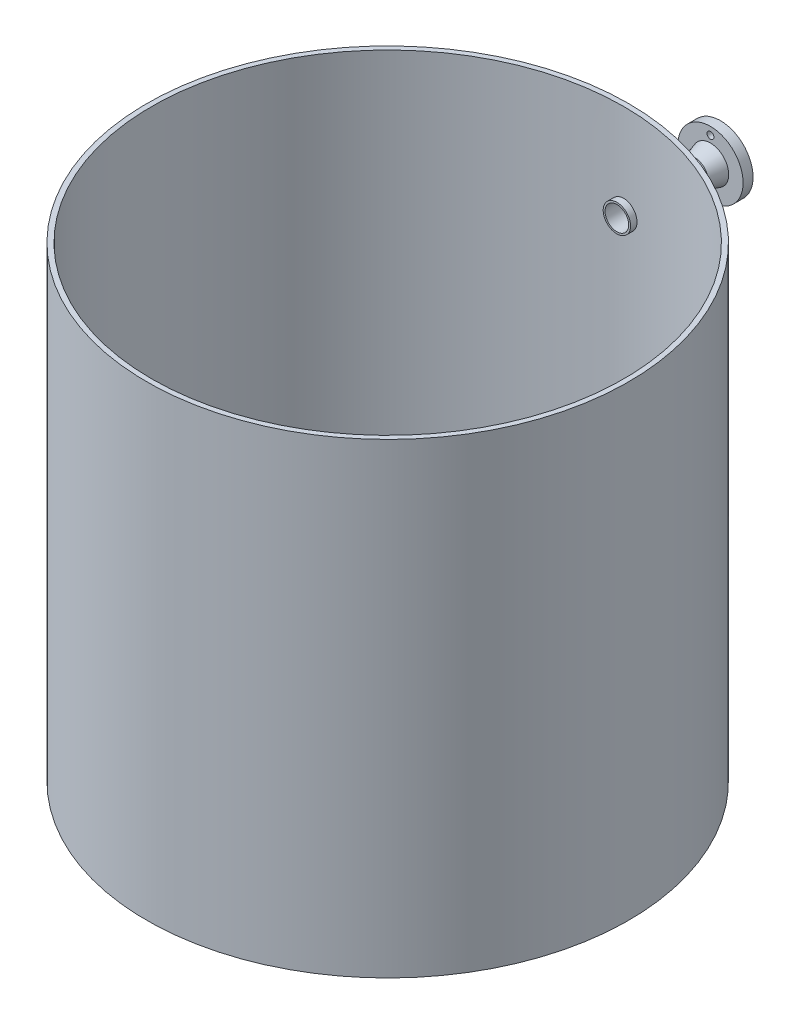
ISO-10303-21;
HEADER;
FILE_DESCRIPTION(('STEP AP214'),'2;1');
FILE_NAME('part.step','',(''),(''),'','','');
FILE_SCHEMA(('AUTOMOTIVE_DESIGN { 1 0 10303 214 1 1 1 1 }'));
ENDSEC;
DATA;
#1=APPLICATION_CONTEXT('core data for automotive mechanical design processes');
#2=APPLICATION_PROTOCOL_DEFINITION('international standard','automotive_design',2000,#1);
#3=PRODUCT_CONTEXT('',#1,'mechanical');
#4=PRODUCT('Part','Part','',(#3));
#5=PRODUCT_RELATED_PRODUCT_CATEGORY('part','',(#4));
#6=PRODUCT_DEFINITION_FORMATION('','',#4);
#7=PRODUCT_DEFINITION_CONTEXT('part definition',#1,'design');
#8=PRODUCT_DEFINITION('design','',#6,#7);
#9=PRODUCT_DEFINITION_SHAPE('','',#8);
#10=(LENGTH_UNIT() NAMED_UNIT(*) SI_UNIT(.MILLI.,.METRE.));
#11=(NAMED_UNIT(*) PLANE_ANGLE_UNIT() SI_UNIT($,.RADIAN.));
#12=(NAMED_UNIT(*) SI_UNIT($,.STERADIAN.) SOLID_ANGLE_UNIT());
#13=UNCERTAINTY_MEASURE_WITH_UNIT(LENGTH_MEASURE(1.E-05),#10,'distance_accuracy_value','');
#14=(GEOMETRIC_REPRESENTATION_CONTEXT(3) GLOBAL_UNCERTAINTY_ASSIGNED_CONTEXT((#13)) GLOBAL_UNIT_ASSIGNED_CONTEXT((#10,
#11,#12)) REPRESENTATION_CONTEXT('',''));
#15=CARTESIAN_POINT('',(0.,0.,0.));
#16=DIRECTION('',(0.,0.,1.));
#17=DIRECTION('',(1.,0.,0.));
#18=AXIS2_PLACEMENT_3D('',#15,#16,#17);
#19=CARTESIAN_POINT('',(0.,0.,0.));
#20=DIRECTION('',(0.,-1.,0.));
#21=DIRECTION('',(0.,0.,-1.));
#22=AXIS2_PLACEMENT_3D('',#19,#20,#21);
#23=CYLINDRICAL_SURFACE('',#22,775.);
#24=CARTESIAN_POINT('',(0.,0.,0.));
#25=DIRECTION('',(0.,-1.,0.));
#26=DIRECTION('',(0.,0.,-1.));
#27=AXIS2_PLACEMENT_3D('',#24,#25,#26);
#28=CIRCLE('',#27,775.);
#29=CARTESIAN_POINT('',(0.,0.,-775.));
#30=VERTEX_POINT('',#29);
#31=EDGE_CURVE('E10',#30,#30,#28,.T.);
#32=ORIENTED_EDGE('',*,*,#31,.F.);
#33=EDGE_LOOP('',(#32));
#34=FACE_BOUND('',#33,.T.);
#35=CARTESIAN_POINT('',(0.,1500.,0.));
#36=DIRECTION('',(0.,-1.,0.));
#37=DIRECTION('',(0.,0.,-1.));
#38=AXIS2_PLACEMENT_3D('',#35,#36,#37);
#39=CIRCLE('',#38,775.);
#40=CARTESIAN_POINT('',(0.,1500.,-775.));
#41=VERTEX_POINT('',#40);
#42=EDGE_CURVE('E55',#41,#41,#39,.T.);
#43=ORIENTED_EDGE('',*,*,#42,.T.);
#44=EDGE_LOOP('',(#43));
#45=FACE_BOUND('',#44,.T.);
#46=CARTESIAN_POINT('',(0.,1244.,-775.));
#47=CARTESIAN_POINT('',(-1.23490051270524,1243.99999187195,-774.999998842845));
#48=CARTESIAN_POINT('',(-2.47003103419844,1243.94796753575,-774.997040489617));
#49=CARTESIAN_POINT('',(-4.93170333839809,1243.74019773534,-774.985286612463));
#50=CARTESIAN_POINT('',(-6.15824284475578,1243.58442575921,-774.976489596512));
#51=CARTESIAN_POINT('',(-8.59516346996752,1243.17003812287,-774.953294943767));
#52=CARTESIAN_POINT('',(-9.80552576295013,1242.91131187748,-774.938891285133));
#53=CARTESIAN_POINT('',(-12.2000078789076,1242.29289276721,-774.904893258689));
#54=CARTESIAN_POINT('',(-13.3841293849541,1241.9332063982,-774.885299224838));
#55=CARTESIAN_POINT('',(-15.7172270865087,1241.11564098644,-774.841486712522));
#56=CARTESIAN_POINT('',(-16.8662204291204,1240.65781075416,-774.817270533468));
#57=CARTESIAN_POINT('',(-19.1215445472124,1239.64711295547,-774.764892751855));
#58=CARTESIAN_POINT('',(-20.2278746716534,1239.09424393947,-774.736731089118));
#59=CARTESIAN_POINT('',(-22.3897625474472,1237.8975543117,-774.677266846262));
#60=CARTESIAN_POINT('',(-23.4453324276264,1237.2537555732,-774.645965022038));
#61=CARTESIAN_POINT('',(-25.4985199809759,1235.87967940291,-774.581100101539));
#62=CARTESIAN_POINT('',(-26.4961378223297,1235.14940222211,-774.547537011828));
#63=CARTESIAN_POINT('',(-28.4274514765434,1233.60668362056,-774.479060351873));
#64=CARTESIAN_POINT('',(-29.3610750770105,1232.794151861,-774.444145323375));
#65=CARTESIAN_POINT('',(-31.1565758459052,1231.09335808243,-774.373989231741));
#66=CARTESIAN_POINT('',(-32.0184528979582,1230.20509594057,-774.338748168076));
#67=CARTESIAN_POINT('',(-33.6643889461261,1228.35909352097,-774.268937557171));
#68=CARTESIAN_POINT('',(-34.4484447577514,1227.40135040279,-774.234368037458));
#69=CARTESIAN_POINT('',(-35.9331375052938,1225.42319766106,-774.166882568525));
#70=CARTESIAN_POINT('',(-36.6337744419652,1224.40278803806,-774.133966619289));
#71=CARTESIAN_POINT('',(-37.9470868631644,1222.3058313769,-774.07070173934));
#72=CARTESIAN_POINT('',(-38.5597037238939,1221.22924756978,-774.040354524952));
#73=CARTESIAN_POINT('',(-39.6920543141824,1219.02820346665,-773.983115052941));
#74=CARTESIAN_POINT('',(-40.2117879867743,1217.90374314127,-773.956222797436));
#75=CARTESIAN_POINT('',(-41.1546521384797,1215.61494450225,-773.906659508791));
#76=CARTESIAN_POINT('',(-41.5777833460667,1214.4506064894,-773.88398844382));
#77=CARTESIAN_POINT('',(-42.3244137800963,1212.09033014446,-773.843513837326));
#78=CARTESIAN_POINT('',(-42.6479131207903,1210.8943918486,-773.825710290221));
#79=CARTESIAN_POINT('',(-43.1926589637929,1208.48075166062,-773.795495361883));
#80=CARTESIAN_POINT('',(-43.4140163750361,1207.26307487277,-773.783078132898));
#81=CARTESIAN_POINT('',(-43.7534069106335,1204.81336159404,-773.763961642556));
#82=CARTESIAN_POINT('',(-43.871440102168,1203.5813251125,-773.757262377482));
#83=CARTESIAN_POINT('',(-44.0033326626017,1201.11168155063,-773.749772925279));
#84=CARTESIAN_POINT('',(-44.0171929420212,1199.87407451909,-773.748982686503));
#85=CARTESIAN_POINT('',(-43.9406422798857,1197.40210039917,-773.753333700491));
#86=CARTESIAN_POINT('',(-43.8502314024187,1196.16773330881,-773.758474949609));
#87=CARTESIAN_POINT('',(-43.5659544004203,1193.71246127161,-773.774532924487));
#88=CARTESIAN_POINT('',(-43.3722084060785,1192.49154236962,-773.785442943751));
#89=CARTESIAN_POINT('',(-42.8827259116379,1190.07038704197,-773.812723992964));
#90=CARTESIAN_POINT('',(-42.5869895028973,1188.87015059778,-773.82909501802));
#91=CARTESIAN_POINT('',(-41.8956415874253,1186.49887207576,-773.866832819246));
#92=CARTESIAN_POINT('',(-41.500029693993,1185.32783011099,-773.888199614758));
#93=CARTESIAN_POINT('',(-40.6117563621746,1183.02324272447,-773.93532217017));
#94=CARTESIAN_POINT('',(-40.1190948389351,1181.88969733551,-773.961077933908));
#95=CARTESIAN_POINT('',(-39.0399172855946,1179.66747758639,-774.016263889724));
#96=CARTESIAN_POINT('',(-38.45334680132,1178.57882972402,-774.045696211506));
#97=CARTESIAN_POINT('',(-37.1907285913545,1176.45480664729,-774.107388550468));
#98=CARTESIAN_POINT('',(-36.5146808429977,1175.41943144644,-774.139648568364));
#99=CARTESIAN_POINT('',(-35.0778991677216,1173.40926324083,-774.206082362964));
#100=CARTESIAN_POINT('',(-34.317164585353,1172.43447070505,-774.240256154478));
#101=CARTESIAN_POINT('',(-32.716399919732,1170.55236213383,-774.309549705754));
#102=CARTESIAN_POINT('',(-31.8763697576633,1169.64504616546,-774.344669466455));
#103=CARTESIAN_POINT('',(-30.1217110477526,1167.90306851879,-774.414910964716));
#104=CARTESIAN_POINT('',(-29.2069785635247,1167.06851152712,-774.450032634671));
#105=CARTESIAN_POINT('',(-27.3104300472603,1165.47941271593,-774.519231916416));
#106=CARTESIAN_POINT('',(-26.3286139476378,1164.72487097702,-774.553309527155));
#107=CARTESIAN_POINT('',(-24.3048532152042,1163.30116148562,-774.619454242604));
#108=CARTESIAN_POINT('',(-23.262908527529,1162.63199381104,-774.651521345481));
#109=CARTESIAN_POINT('',(-21.1262774440984,1161.38379619256,-774.712735428498));
#110=CARTESIAN_POINT('',(-20.0315910712869,1160.80476620946,-774.741882409909));
#111=CARTESIAN_POINT('',(-17.7971965419089,1159.74095242246,-774.796430387714));
#112=CARTESIAN_POINT('',(-16.6574864967475,1159.25617257711,-774.821831226757));
#113=CARTESIAN_POINT('',(-14.3411861186688,1158.38435743867,-774.868164319476));
#114=CARTESIAN_POINT('',(-13.1645957787506,1157.99732216413,-774.889096572304));
#115=CARTESIAN_POINT('',(-10.7829176708565,1157.32377491677,-774.925897741629));
#116=CARTESIAN_POINT('',(-9.57783012789139,1157.03726215052,-774.941766698092));
#117=CARTESIAN_POINT('',(-7.14773724539119,1156.56681551491,-774.967990480062));
#118=CARTESIAN_POINT('',(-5.92273192959694,1156.3828815233,-774.978345312139));
#119=CARTESIAN_POINT('',(-3.46325858723033,1156.11910029925,-774.993236099942));
#120=CARTESIAN_POINT('',(-2.22880612600184,1156.03910837676,-774.997780144293));
#121=CARTESIAN_POINT('',(0.24245817873926,1155.98331253725,-775.000947088034));
#122=CARTESIAN_POINT('',(1.47927002007144,1156.007508524,-774.999569992892));
#123=CARTESIAN_POINT('',(3.94644224397655,1156.15991411186,-774.990933734942));
#124=CARTESIAN_POINT('',(5.17680265316937,1156.28812328346,-774.983674596422));
#125=CARTESIAN_POINT('',(7.62232075836766,1156.64763354004,-774.963480128506));
#126=CARTESIAN_POINT('',(8.8374784556896,1156.8789346161,-774.950544799601));
#127=CARTESIAN_POINT('',(11.2431615978747,1157.44278403041,-774.919374869633));
#128=CARTESIAN_POINT('',(12.433702649046,1157.77526598104,-774.901143743646));
#129=CARTESIAN_POINT('',(14.7825277813347,1158.53915102427,-774.859894868812));
#130=CARTESIAN_POINT('',(15.940811881656,1158.97055405796,-774.836877122816));
#131=CARTESIAN_POINT('',(18.2169269912185,1159.92920626858,-774.786705840629));
#132=CARTESIAN_POINT('',(19.334757767408,1160.45645599757,-774.759552280618));
#133=CARTESIAN_POINT('',(21.5220548577472,1161.60304835278,-774.701877010902));
#134=CARTESIAN_POINT('',(22.5915211167051,1162.22239108409,-774.671355297354));
#135=CARTESIAN_POINT('',(24.6756837113987,1163.54950541334,-774.607771054481));
#136=CARTESIAN_POINT('',(25.6903183552265,1164.25737376367,-774.574705760654));
#137=CARTESIAN_POINT('',(27.6563685021355,1165.75597749999,-774.506999960951));
#138=CARTESIAN_POINT('',(28.6077839636269,1166.5467129405,-774.472359454039));
#139=CARTESIAN_POINT('',(30.4406745802842,1168.2054553439,-774.402483632884));
#140=CARTESIAN_POINT('',(31.3221492261823,1169.07346286935,-774.367248314313));
#141=CARTESIAN_POINT('',(33.0089149331861,1170.88060317902,-774.297180858173));
#142=CARTESIAN_POINT('',(33.8142059487583,1171.81973600575,-774.262348720846));
#143=CARTESIAN_POINT('',(35.343777323701,1173.76359971132,-774.194035343931));
#144=CARTESIAN_POINT('',(36.0679638291958,1174.76840450004,-774.160555697494));
#145=CARTESIAN_POINT('',(37.429112865219,1176.83552419892,-774.095941048894));
#146=CARTESIAN_POINT('',(38.0660753183511,1177.89783916013,-774.064806048812));
#147=CARTESIAN_POINT('',(39.2482340919216,1180.07243849469,-774.005766489924));
#148=CARTESIAN_POINT('',(39.7934307794706,1181.18472266813,-773.977861918196));
#149=CARTESIAN_POINT('',(40.7881653284228,1183.4513639638,-773.926077726876));
#150=CARTESIAN_POINT('',(41.2377032749596,1184.60572104858,-773.902198103701));
#151=CARTESIAN_POINT('',(42.0376605789888,1186.94759591906,-773.859157459514));
#152=CARTESIAN_POINT('',(42.3881391858039,1188.1350934138,-773.839993618791));
#153=CARTESIAN_POINT('',(42.9878224821321,1190.53546286924,-773.806912225468));
#154=CARTESIAN_POINT('',(43.2370271987067,1191.74833482316,-773.792994671466));
#155=CARTESIAN_POINT('',(43.6323702502713,1194.19080507329,-773.77080297529));
#156=CARTESIAN_POINT('',(43.778509243878,1195.42040326258,-773.762528797055));
#157=CARTESIAN_POINT('',(43.9666713346145,1197.88756526352,-773.751859919666));
#158=CARTESIAN_POINT('',(44.0086945349623,1199.12512906728,-773.749465214684));
#159=CARTESIAN_POINT('',(43.9883372487358,1201.59764358311,-773.750622797362));
#160=CARTESIAN_POINT('',(43.9261042574283,1202.83259551612,-773.75416668347));
#161=CARTESIAN_POINT('',(43.6979625069362,1205.29285362065,-773.767084519146));
#162=CARTESIAN_POINT('',(43.5320538522241,1206.51815980188,-773.776458462838));
#163=CARTESIAN_POINT('',(43.0977511696663,1208.9504174394,-773.800769620422));
#164=CARTESIAN_POINT('',(42.8293570159316,1210.15736887314,-773.815706841147));
#165=CARTESIAN_POINT('',(42.1920062381181,1212.54434450764,-773.85071968314));
#166=CARTESIAN_POINT('',(41.8230495701631,1213.72436869665,-773.870795306649));
#167=CARTESIAN_POINT('',(40.9872120252563,1216.04911908188,-773.915514419115));
#168=CARTESIAN_POINT('',(40.5203312471295,1217.19384531372,-773.940157903461));
#169=CARTESIAN_POINT('',(39.4919747291611,1219.43989449478,-773.993313177381));
#170=CARTESIAN_POINT('',(38.9304989877822,1220.54121744329,-774.021824967017));
#171=CARTESIAN_POINT('',(37.7169639147249,1222.69264001368,-774.081907484598));
#172=CARTESIAN_POINT('',(37.0649072670214,1223.74274115206,-774.113478121897));
#173=CARTESIAN_POINT('',(35.6748238125981,1225.78433752683,-774.178784831867));
#174=CARTESIAN_POINT('',(34.9367969888749,1226.77583275164,-774.212520904966));
#175=CARTESIAN_POINT('',(33.3789844436645,1228.69446569563,-774.281248539298));
#176=CARTESIAN_POINT('',(32.5590937002047,1229.62151808896,-774.316241675398));
#177=CARTESIAN_POINT('',(30.8441616833336,1231.40329003667,-774.386450001343));
#178=CARTESIAN_POINT('',(29.9491200542672,1232.25800924871,-774.421665192237));
#179=CARTESIAN_POINT('',(28.0899912853695,1233.88926246375,-774.491328347202));
#180=CARTESIAN_POINT('',(27.1258868441166,1234.66577675703,-774.525776116167));
#181=CARTESIAN_POINT('',(25.1356729157731,1236.13485439456,-774.592918294138));
#182=CARTESIAN_POINT('',(24.1095643772926,1236.82741902267,-774.625612729953));
#183=CARTESIAN_POINT('',(22.0014613665148,1238.12438753778,-774.6883558722));
#184=CARTESIAN_POINT('',(20.9194077869099,1238.72869549131,-774.718401685774));
#185=CARTESIAN_POINT('',(18.7080383030125,1239.8439811615,-774.7749560013));
#186=CARTESIAN_POINT('',(17.5787193186355,1240.35495278414,-774.801464272255));
#187=CARTESIAN_POINT('',(15.2822091560377,1241.27934993945,-774.850160894225));
#188=CARTESIAN_POINT('',(14.115060385721,1241.69288067728,-774.872353899787));
#189=CARTESIAN_POINT('',(11.7501753068357,1242.42007660582,-774.911821262391));
#190=CARTESIAN_POINT('',(10.5524469529405,1242.73376748767,-774.929096884671));
#191=CARTESIAN_POINT('',(8.57711509101011,1243.16305332635,-774.952916033834));
#192=CARTESIAN_POINT('',(7.80601651338606,1243.30914247739,-774.961074054632));
#193=CARTESIAN_POINT('',(6.25698431516876,1243.55990844221,-774.975128505864));
#194=CARTESIAN_POINT('',(5.47905015532275,1243.66458195821,-774.9810247562));
#195=CARTESIAN_POINT('',(3.91868369401944,1243.83217568741,-774.990485497649));
#196=CARTESIAN_POINT('',(3.13625139609738,1243.89509593343,-774.994049990593));
#197=CARTESIAN_POINT('',(1.56924356955507,1243.97900899575,-774.998807514589));
#198=CARTESIAN_POINT('',(0.784668217336191,1244.00000516464,-775.000000735268));
#199=CARTESIAN_POINT('',(0.,1244.,-775.));
#200=B_SPLINE_CURVE_WITH_KNOTS('',3,(#46,#47,#48,#49,#50,#51,#52,#53,#54,#55,#56,#57,#58,#59,
#60,#61,#62,#63,#64,#65,#66,#67,#68,#69,#70,#71,#72,#73,#74,#75,#76,#77,#78,#79,#80,#81,#82,#83,
#84,#85,#86,#87,#88,#89,#90,#91,#92,#93,#94,#95,#96,#97,#98,#99,#100,#101,#102,#103,#104,#105,
#106,#107,#108,#109,#110,#111,#112,#113,#114,#115,#116,#117,#118,#119,#120,#121,#122,#123,#124,
#125,#126,#127,#128,#129,#130,#131,#132,#133,#134,#135,#136,#137,#138,#139,#140,#141,#142,#143,
#144,#145,#146,#147,#148,#149,#150,#151,#152,#153,#154,#155,#156,#157,#158,#159,#160,#161,#162,
#163,#164,#165,#166,#167,#168,#169,#170,#171,#172,#173,#174,#175,#176,#177,#178,#179,#180,#181,
#182,#183,#184,#185,#186,#187,#188,#189,#190,#191,#192,#193,#194,#195,#196,#197,#198,#199),
.UNSPECIFIED.,.T.,.F.,(4,2,2,2,2,2,2,2,2,2,2,2,2,2,2,2,2,2,2,2,2,2,2,2,2,2,2,2,2,2,2,2,2,2,2,2,
2,2,2,2,2,2,2,2,2,2,2,2,2,2,2,2,2,2,2,2,2,2,2,2,2,2,2,2,2,2,2,2,2,2,2,2,2,2,2,2,4),(0.,
3.70400293927086,7.40895277208476,11.1178929520149,14.8265945496972,18.5334559389454,
22.2403738723992,25.9464016156834,29.6524186031182,33.362550937933,37.0726892905562,
40.7829794016203,44.4932694791267,48.2060193694716,51.9187715369071,55.6314957057697,
59.3442156170988,63.0528945979578,66.7615711674757,70.470215321375,74.1788571958354,
77.8831970297617,81.5875335455214,85.2918844040586,88.9962385014389,92.7027484426363,
96.4092593227506,100.115798892081,103.822342145586,107.534133319242,111.245928232537,
114.957726532695,118.66952321815,122.381475766936,126.093429020362,129.805352974405,
133.517272504384,137.224019391101,140.930762853885,144.637491009864,148.344218844864,
152.048519816277,155.752818582317,159.457138685436,163.161463015678,166.869871890318,
170.578283204578,174.28672151883,177.995162049537,181.707850576049,185.420542396907,
189.133219364723,192.845893028349,196.556341347375,200.266788674923,203.977212291533,
207.687632229719,211.39280732505,215.097978686729,218.803154599707,222.508332129293,
226.213505919637,229.918679770194,233.623743857296,237.328808677201,241.038689277192,
244.748587435348,248.459418259108,252.170192324664,255.884970386138,259.599990901892,
263.31098180787,267.021017015532,269.374580485386,271.728331323136,274.082080311244,
276.435641066514),.UNSPECIFIED.);
#201=CARTESIAN_POINT('',(0.,1244.,-775.));
#202=VERTEX_POINT('',#201);
#203=EDGE_CURVE('E70',#202,#202,#200,.T.);
#204=ORIENTED_EDGE('',*,*,#203,.T.);
#205=EDGE_LOOP('',(#204));
#206=FACE_BOUND('',#205,.T.);
#207=ADVANCED_FACE('F41',(#34,#45,#206),#23,.T.);
#208=CARTESIAN_POINT('',(0.,0.,0.));
#209=DIRECTION('',(0.,-1.,0.));
#210=DIRECTION('',(0.,0.,-1.));
#211=AXIS2_PLACEMENT_3D('',#208,#209,#210);
#212=CYLINDRICAL_SURFACE('',#211,759.);
#213=CARTESIAN_POINT('',(0.,1500.,0.));
#214=DIRECTION('',(0.,-1.,0.));
#215=DIRECTION('',(0.,0.,-1.));
#216=AXIS2_PLACEMENT_3D('',#213,#214,#215);
#217=CIRCLE('',#216,759.);
#218=CARTESIAN_POINT('',(0.,1500.,-759.));
#219=VERTEX_POINT('',#218);
#220=EDGE_CURVE('E60',#219,#219,#217,.T.);
#221=ORIENTED_EDGE('',*,*,#220,.F.);
#222=EDGE_LOOP('',(#221));
#223=FACE_BOUND('',#222,.T.);
#224=CARTESIAN_POINT('',(0.,0.,0.));
#225=DIRECTION('',(0.,-1.,0.));
#226=DIRECTION('',(0.,0.,-1.));
#227=AXIS2_PLACEMENT_3D('',#224,#225,#226);
#228=CIRCLE('',#227,759.);
#229=CARTESIAN_POINT('',(0.,0.,-759.));
#230=VERTEX_POINT('',#229);
#231=EDGE_CURVE('E66',#230,#230,#228,.T.);
#232=ORIENTED_EDGE('',*,*,#231,.T.);
#233=EDGE_LOOP('',(#232));
#234=FACE_BOUND('',#233,.T.);
#235=CARTESIAN_POINT('',(0.,1244.,-759.));
#236=CARTESIAN_POINT('',(1.2348548425814,1243.99999187476,-758.999998819198));
#237=CARTESIAN_POINT('',(2.46993940811744,1243.94797138355,-758.99697832679));
#238=CARTESIAN_POINT('',(4.93151933845994,1243.74021715262,-758.984977563636));
#239=CARTESIAN_POINT('',(6.15801242974214,1243.58445693603,-758.975995771426));
#240=CARTESIAN_POINT('',(8.59483831399241,1243.17010142423,-758.952313931602));
#241=CARTESIAN_POINT('',(9.80515230399406,1242.91139568891,-758.937607743218));
#242=CARTESIAN_POINT('',(12.1995381850212,1242.29302671087,-758.902895602395));
#243=CARTESIAN_POINT('',(13.3836117567775,1241.93336995448,-758.88288999046));
#244=CARTESIAN_POINT('',(15.7166125899503,1241.1158741322,-758.838157153313));
#245=CARTESIAN_POINT('',(16.8655570613594,1240.65808405257,-758.813432284534));
#246=CARTESIAN_POINT('',(19.1207860732055,1239.64747682464,-758.75995411489));
#247=CARTESIAN_POINT('',(20.2270699636219,1239.09465822909,-758.731200752672));
#248=CARTESIAN_POINT('',(22.3888705509332,1237.89807918262,-758.670486874667));
#249=CARTESIAN_POINT('',(23.4443993440589,1237.2543405457,-758.638527128704));
#250=CARTESIAN_POINT('',(25.4975112588885,1235.88039392797,-758.572298493938));
#251=CARTESIAN_POINT('',(26.4950945462771,1235.15018619442,-758.538029611739));
#252=CARTESIAN_POINT('',(28.426388892226,1233.60758179536,-758.468111001627));
#253=CARTESIAN_POINT('',(29.3600249733949,1232.79509132882,-758.43245972703));
#254=CARTESIAN_POINT('',(31.1555549639527,1231.09438029872,-758.360823678743));
#255=CARTESIAN_POINT('',(32.0174487551223,1230.20615961036,-758.324838904505));
#256=CARTESIAN_POINT('',(33.6634234774229,1228.36023880011,-758.253554394962));
#257=CARTESIAN_POINT('',(34.4475012174159,1227.40253583162,-758.218254687799));
#258=CARTESIAN_POINT('',(35.9322433708531,1225.4244605972,-758.149343077238));
#259=CARTESIAN_POINT('',(36.6329077843643,1224.40408833131,-758.115731173839));
#260=CARTESIAN_POINT('',(37.9462998889606,1222.30717137709,-758.051126986342));
#261=CARTESIAN_POINT('',(38.5589663722878,1221.23058829373,-758.020136531718));
#262=CARTESIAN_POINT('',(39.6914156032556,1219.0295373976,-757.961683188001));
#263=CARTESIAN_POINT('',(40.2111982915626,1217.90506955425,-757.93422030116));
#264=CARTESIAN_POINT('',(41.1541584948321,1215.61624776806,-757.883604740827));
#265=CARTESIAN_POINT('',(41.5773367611896,1214.45189413552,-757.860452033809));
#266=CARTESIAN_POINT('',(42.324058062877,1212.0915786323,-757.819116986836));
#267=CARTESIAN_POINT('',(42.6476012173469,1210.8956167994,-757.800934640938));
#268=CARTESIAN_POINT('',(43.1924174108361,1208.48197861082,-757.770076958911));
#269=CARTESIAN_POINT('',(43.4138060821737,1207.26432843518,-757.757395397227));
#270=CARTESIAN_POINT('',(43.7532630658685,1204.81466391271,-757.737870862677));
#271=CARTESIAN_POINT('',(43.8713314482584,1203.58264957561,-757.731027885854));
#272=CARTESIAN_POINT('',(44.0032976259388,1201.11304686607,-757.7233757717));
#273=CARTESIAN_POINT('',(44.0171963625464,1199.8754585441,-757.722566579845));
#274=CARTESIAN_POINT('',(43.9407256010216,1197.4035188814,-757.727004987578));
#275=CARTESIAN_POINT('',(43.8503561697241,1196.16916753859,-757.732252583284));
#276=CARTESIAN_POINT('',(43.5661721105574,1193.71398583569,-757.748644882466));
#277=CARTESIAN_POINT('',(43.372482748717,1192.49314092598,-757.759782444754));
#278=CARTESIAN_POINT('',(42.8831269386279,1190.07212943848,-757.787633440839));
#279=CARTESIAN_POINT('',(42.5874605856374,1188.87196284137,-757.804346869427));
#280=CARTESIAN_POINT('',(41.8962662669394,1186.50081853575,-757.84287458321));
#281=CARTESIAN_POINT('',(41.5007379027209,1185.32984094374,-757.86468888876));
#282=CARTESIAN_POINT('',(40.6126450668817,1183.02537532675,-757.912798850557));
#283=CARTESIAN_POINT('',(40.1200805068225,1181.89188733594,-757.939094510888));
#284=CARTESIAN_POINT('',(39.0410966650762,1179.66974603226,-757.995438385783));
#285=CARTESIAN_POINT('',(38.4546206289736,1178.58112033487,-758.025488867107));
#286=CARTESIAN_POINT('',(37.1921991603646,1176.45713308251,-758.088477382061));
#287=CARTESIAN_POINT('',(36.5162537042402,1175.4217715416,-758.121415416454));
#288=CARTESIAN_POINT('',(35.0796830773309,1173.41161985113,-758.189245972635));
#289=CARTESIAN_POINT('',(34.3190572218563,1172.43683019143,-758.224138510227));
#290=CARTESIAN_POINT('',(32.7185149633596,1170.55471503639,-758.294890027012));
#291=CARTESIAN_POINT('',(31.8785984781672,1169.64738961096,-758.330749007208));
#292=CARTESIAN_POINT('',(30.1241170066961,1167.90532641435,-758.402471857127));
#293=CARTESIAN_POINT('',(29.2094436466823,1167.07069778256,-758.438335655915));
#294=CARTESIAN_POINT('',(27.3130058746725,1165.48145050883,-758.508997872879));
#295=CARTESIAN_POINT('',(26.3312413922032,1164.72683195094,-758.543796289938));
#296=CARTESIAN_POINT('',(24.307574952973,1163.30296394237,-758.611340893508));
#297=CARTESIAN_POINT('',(23.2656729391666,1162.63371457268,-758.644087078073));
#298=CARTESIAN_POINT('',(21.1291170642714,1161.38534952528,-758.706598366976));
#299=CARTESIAN_POINT('',(20.0344632270941,1160.80623380671,-758.736363472666));
#300=CARTESIAN_POINT('',(17.8001203461711,1159.7422445852,-758.792069304073));
#301=CARTESIAN_POINT('',(16.6604293178088,1159.25737524093,-758.818009861019));
#302=CARTESIAN_POINT('',(14.344155405343,1158.38538023168,-758.865328561772));
#303=CARTESIAN_POINT('',(13.167572513929,1157.99825458608,-758.886706704676));
#304=CARTESIAN_POINT('',(10.7858984406849,1157.32452752607,-758.924293133559));
#305=CARTESIAN_POINT('',(9.58080749350028,1157.03792528457,-758.940501462074));
#306=CARTESIAN_POINT('',(7.15069748063961,1156.56730206511,-758.967287812789));
#307=CARTESIAN_POINT('',(5.92567843973253,1156.38328095965,-758.977865841987));
#308=CARTESIAN_POINT('',(3.46624162565063,1156.11933713262,-758.99307980908));
#309=CARTESIAN_POINT('',(2.23184009149439,1156.03926357345,-758.997724356853));
#310=CARTESIAN_POINT('',(-0.239329808815112,1155.98329668901,-759.000967968925));
#311=CARTESIAN_POINT('',(-1.47609817268806,1156.00740326341,-758.999567039044));
#312=CARTESIAN_POINT('',(-3.94319043231368,1156.15962279732,-758.990759448925));
#313=CARTESIAN_POINT('',(-5.17351435580406,1156.28773530879,-758.983352814558));
#314=CARTESIAN_POINT('',(-7.61896655649365,1156.64704527433,-758.962743867439));
#315=CARTESIAN_POINT('',(-8.83409483506921,1156.87824271906,-758.949541555213));
#316=CARTESIAN_POINT('',(-11.2396923803285,1157.44187009884,-758.917726379424));
#317=CARTESIAN_POINT('',(-12.4301779202454,1157.7742307932,-758.899117216949));
#318=CARTESIAN_POINT('',(-14.7789017560532,1158.53786098125,-758.857011409508));
#319=CARTESIAN_POINT('',(-15.9371400719661,1158.96913041352,-758.833514767577));
#320=CARTESIAN_POINT('',(-18.2131752897088,1159.92750368409,-758.78229826353));
#321=CARTESIAN_POINT('',(-19.3309719486247,1160.4546080979,-758.754578376052));
#322=CARTESIAN_POINT('',(-21.5182142271286,1161.60089890369,-758.695698894603));
#323=CARTESIAN_POINT('',(-22.5876597892122,1162.22008540516,-758.66453929654));
#324=CARTESIAN_POINT('',(-24.6718450979583,1163.54690845991,-758.599623332933));
#325=CARTESIAN_POINT('',(-25.6865205656552,1164.25464584022,-758.565864024393));
#326=CARTESIAN_POINT('',(-27.6526640883624,1165.75298757281,-758.496735666358));
#327=CARTESIAN_POINT('',(-28.6041321000438,1166.54359198191,-758.46136661576));
#328=CARTESIAN_POINT('',(-30.4371409918221,1168.20207427931,-758.390019669539));
#329=CARTESIAN_POINT('',(-31.3186813420189,1169.06995275308,-758.354041769305));
#330=CARTESIAN_POINT('',(-33.0055921950321,1170.87683889024,-758.282496045194));
#331=CARTESIAN_POINT('',(-33.8109626503493,1171.81584659798,-758.246928221572));
#332=CARTESIAN_POINT('',(-35.3407447392824,1173.75951406222,-758.177168581979));
#333=CARTESIAN_POINT('',(-36.0650585052973,1174.76425091036,-758.142978460631));
#334=CARTESIAN_POINT('',(-37.4264672357306,1176.83124884166,-758.076990951552));
#335=CARTESIAN_POINT('',(-38.063562119442,1177.89350997805,-758.045193566034));
#336=CARTESIAN_POINT('',(-39.2459894445106,1180.06801672688,-757.984896253089));
#337=CARTESIAN_POINT('',(-39.7913222641969,1181.18026213321,-757.956396312067));
#338=CARTESIAN_POINT('',(-40.7863310628008,1183.44684168462,-757.903505454697));
#339=CARTESIAN_POINT('',(-41.236007130444,1184.60117579065,-757.879114534539));
#340=CARTESIAN_POINT('',(-42.0362306276217,1186.94299142657,-757.835150892375));
#341=CARTESIAN_POINT('',(-42.3868397630072,1188.13045181433,-757.815575172113));
#342=CARTESIAN_POINT('',(-42.986787143765,1190.53076122897,-757.781780271877));
#343=CARTESIAN_POINT('',(-43.2361254173105,1191.74361024877,-757.767561090414));
#344=CARTESIAN_POINT('',(-43.6317367480707,1194.18604779318,-757.744885088374));
#345=CARTESIAN_POINT('',(-43.7780105001463,1195.41563620486,-757.736428228948));
#346=CARTESIAN_POINT('',(-43.9664418843635,1197.8827911631,-757.725518200516));
#347=CARTESIAN_POINT('',(-44.0085996241812,1199.12035770139,-757.7230650253));
#348=CARTESIAN_POINT('',(-43.9885104947971,1201.59281410086,-757.724231521413));
#349=CARTESIAN_POINT('',(-43.9264174192942,1202.8277052187,-757.727842247108));
#350=CARTESIAN_POINT('',(-43.6985659611736,1205.28785314612,-757.741016650233));
#351=CARTESIAN_POINT('',(-43.5328076874865,1206.51310996583,-757.750580321407));
#352=CARTESIAN_POINT('',(-43.0988156345954,1208.94528065483,-757.775388390638));
#353=CARTESIAN_POINT('',(-42.8305817332073,1210.15219450225,-757.790632795468));
#354=CARTESIAN_POINT('',(-42.1935608137536,1212.53910744705,-757.826368687489));
#355=CARTESIAN_POINT('',(-41.8247737499154,1213.71910653218,-757.846860177069));
#356=CARTESIAN_POINT('',(-40.9892848300567,1216.0438184167,-757.892507821768));
#357=CARTESIAN_POINT('',(-40.5225832218133,1217.18853130537,-757.917663965084));
#358=CARTESIAN_POINT('',(-39.4945932894325,1219.43456882513,-757.971926824165));
#359=CARTESIAN_POINT('',(-38.9333049645277,1220.53589345587,-758.001033539962));
#360=CARTESIAN_POINT('',(-37.7201514643374,1222.68733661211,-758.062371340427));
#361=CARTESIAN_POINT('',(-37.0682889372898,1223.73745663354,-758.094602333739));
#362=CARTESIAN_POINT('',(-35.6785988393301,1225.77910947131,-758.161276572866));
#363=CARTESIAN_POINT('',(-34.9407712469868,1226.77064227306,-758.195719819232));
#364=CARTESIAN_POINT('',(-33.3833135873369,1228.68942835764,-758.265891772722));
#365=CARTESIAN_POINT('',(-32.5635736637337,1229.61659241189,-758.301622163911));
#366=CARTESIAN_POINT('',(-30.84893454177,1231.3986008033,-758.373311301761));
#367=CARTESIAN_POINT('',(-29.9540349851008,1232.25344479564,-758.40927004951));
#368=CARTESIAN_POINT('',(-28.0951796869168,1233.88496065882,-758.480405792594));
#369=CARTESIAN_POINT('',(-27.1312066512072,1234.66161283458,-758.515582589241));
#370=CARTESIAN_POINT('',(-25.1412424890075,1236.13097901572,-758.58414750793));
#371=CARTESIAN_POINT('',(-24.1152523099723,1236.82369430295,-758.617535657283));
#372=CARTESIAN_POINT('',(-22.0073421167707,1238.12099386947,-758.68161292361));
#373=CARTESIAN_POINT('',(-20.9253614767282,1238.72547979091,-758.712299013448));
#374=CARTESIAN_POINT('',(-18.7141186535828,1239.84112644224,-758.770060559463));
#375=CARTESIAN_POINT('',(-17.5848533914242,1240.35228108298,-758.797135780026));
#376=CARTESIAN_POINT('',(-15.288429634624,1241.27704737483,-758.846876254554));
#377=CARTESIAN_POINT('',(-14.1213135323518,1241.69076413599,-758.869546255939));
#378=CARTESIAN_POINT('',(-11.7564738275386,1242.41833240948,-758.909864634161));
#379=CARTESIAN_POINT('',(-10.5587581774677,1242.73220958941,-758.927514301545));
#380=CARTESIAN_POINT('',(-8.58292927476996,1243.16190732126,-758.951858202292));
#381=CARTESIAN_POINT('',(-7.811321018025,1243.30819580782,-758.960199392014));
#382=CARTESIAN_POINT('',(-6.26125449199141,1243.55930455044,-758.974569502377));
#383=CARTESIAN_POINT('',(-5.48279568017542,1243.66412149141,-758.980598238167));
#384=CARTESIAN_POINT('',(-3.92137008063169,1243.831945085,-758.990271596443));
#385=CARTESIAN_POINT('',(-3.13840329661318,1243.89495177202,-758.993916220891));
#386=CARTESIAN_POINT('',(-1.57032185141252,1243.97898012737,-758.998780700748));
#387=CARTESIAN_POINT('',(-0.78520736774874,1244.0000051666,-759.000000750837));
#388=CARTESIAN_POINT('',(0.,1244.,-759.));
#389=B_SPLINE_CURVE_WITH_KNOTS('',3,(#235,#236,#237,#238,#239,#240,#241,#242,#243,#244,#245,
#246,#247,#248,#249,#250,#251,#252,#253,#254,#255,#256,#257,#258,#259,#260,#261,#262,#263,#264,
#265,#266,#267,#268,#269,#270,#271,#272,#273,#274,#275,#276,#277,#278,#279,#280,#281,#282,#283,
#284,#285,#286,#287,#288,#289,#290,#291,#292,#293,#294,#295,#296,#297,#298,#299,#300,#301,#302,
#303,#304,#305,#306,#307,#308,#309,#310,#311,#312,#313,#314,#315,#316,#317,#318,#319,#320,#321,
#322,#323,#324,#325,#326,#327,#328,#329,#330,#331,#332,#333,#334,#335,#336,#337,#338,#339,#340,
#341,#342,#343,#344,#345,#346,#347,#348,#349,#350,#351,#352,#353,#354,#355,#356,#357,#358,#359,
#360,#361,#362,#363,#364,#365,#366,#367,#368,#369,#370,#371,#372,#373,#374,#375,#376,#377,#378,
#379,#380,#381,#382,#383,#384,#385,#386,#387,#388),.UNSPECIFIED.,.T.,.F.,(4,2,2,2,2,2,2,2,2,2,2,
2,2,2,2,2,2,2,2,2,2,2,2,2,2,2,2,2,2,2,2,2,2,2,2,2,2,2,2,2,2,2,2,2,2,2,2,2,2,2,2,2,2,2,2,2,2,2,2,
2,2,2,2,2,2,2,2,2,2,2,2,2,2,2,2,2,4),(0.,3.70386540916142,7.40867649584979,11.1174728716647,
14.826031003925,18.5327421885313,22.2395098301164,25.9453896311505,29.6512588353581,
33.3614012716358,37.0715498214841,40.7818504570288,44.4921510895913,48.2050200858011,
51.9178914537625,55.6307339418088,59.343571990162,63.0521969716872,66.7608194394178,
70.4694083945614,74.1779949725338,77.8820954117615,81.5861923909405,85.2903041519832,
88.9944192889553,92.7007814767094,96.4071446428694,100.113537779285,103.819934756746,
107.531803524983,111.243676192276,114.955552380653,118.667426886513,122.37946514327,
126.091504135613,129.803512585356,133.515516421733,137.22212775083,140.928735510614,
144.635327303544,148.341918760747,152.045978942807,155.750036824983,159.45411695199,
163.158201484174,166.866542663987,170.574886385855,174.283258206239,177.991632339127,
181.704436713787,185.417244524019,189.130037026203,192.8428260846,196.553297433221,
200.263767749601,203.97421304975,207.68465451258,211.38962703731,215.094595668887,
218.799568718002,222.504543453656,226.209508813818,229.914474204038,233.61933129006,
237.324189299712,241.03408450558,244.743997398639,248.454842424633,252.165630773241,
255.880524810184,259.595661129035,263.306771238829,267.016926492683,269.372106889031,
271.727475512365,274.082842197936,276.438019752524),.UNSPECIFIED.);
#390=CARTESIAN_POINT('',(0.,1244.,-759.));
#391=VERTEX_POINT('',#390);
#392=EDGE_CURVE('E45',#391,#391,#389,.T.);
#393=ORIENTED_EDGE('',*,*,#392,.T.);
#394=EDGE_LOOP('',(#393));
#395=FACE_BOUND('',#394,.T.);
#396=ADVANCED_FACE('F103',(#223,#234,#395),#212,.F.);
#397=CARTESIAN_POINT('',(759.,0.,0.));
#398=DIRECTION('',(0.,-1.,0.));
#399=DIRECTION('',(0.,0.,-1.));
#400=AXIS2_PLACEMENT_3D('',#397,#398,#399);
#401=PLANE('',#400);
#402=ORIENTED_EDGE('',*,*,#31,.T.);
#403=EDGE_LOOP('',(#402));
#404=FACE_BOUND('',#403,.T.);
#405=ORIENTED_EDGE('',*,*,#231,.F.);
#406=EDGE_LOOP('',(#405));
#407=FACE_BOUND('',#406,.T.);
#408=ADVANCED_FACE('F43',(#404,#407),#401,.T.);
#409=CARTESIAN_POINT('',(775.,1500.,0.));
#410=DIRECTION('',(0.,1.,0.));
#411=DIRECTION('',(0.,0.,1.));
#412=AXIS2_PLACEMENT_3D('',#409,#410,#411);
#413=PLANE('',#412);
#414=ORIENTED_EDGE('',*,*,#220,.T.);
#415=EDGE_LOOP('',(#414));
#416=FACE_BOUND('',#415,.T.);
#417=ORIENTED_EDGE('',*,*,#42,.F.);
#418=EDGE_LOOP('',(#417));
#419=FACE_BOUND('',#418,.T.);
#420=ADVANCED_FACE('F95',(#416,#419),#413,.T.);
#421=CARTESIAN_POINT('',(0.,1238.,-737.));
#422=DIRECTION('',(0.,0.,-1.));
#423=DIRECTION('',(-1.,0.,0.));
#424=AXIS2_PLACEMENT_3D('',#421,#422,#423);
#425=PLANE('',#424);
#426=CARTESIAN_POINT('',(0.,1200.,-737.));
#427=DIRECTION('',(0.,0.,1.));
#428=DIRECTION('',(1.,0.,0.));
#429=AXIS2_PLACEMENT_3D('',#426,#427,#428);
#430=CIRCLE('',#429,38.);
#431=CARTESIAN_POINT('',(38.,1200.,-737.));
#432=VERTEX_POINT('',#431);
#433=EDGE_CURVE('E135',#432,#432,#430,.T.);
#434=ORIENTED_EDGE('',*,*,#433,.F.);
#435=EDGE_LOOP('',(#434));
#436=FACE_BOUND('',#435,.T.);
#437=CARTESIAN_POINT('',(0.,1200.,-737.));
#438=DIRECTION('',(0.,0.,1.));
#439=DIRECTION('',(1.,0.,0.));
#440=AXIS2_PLACEMENT_3D('',#437,#438,#439);
#441=CIRCLE('',#440,44.);
#442=CARTESIAN_POINT('',(44.,1200.,-737.));
#443=VERTEX_POINT('',#442);
#444=EDGE_CURVE('E129',#443,#443,#441,.T.);
#445=ORIENTED_EDGE('',*,*,#444,.T.);
#446=EDGE_LOOP('',(#445));
#447=FACE_BOUND('',#446,.T.);
#448=ADVANCED_FACE('F87',(#436,#447),#425,.F.);
#449=CARTESIAN_POINT('',(0.,1200.,-775.));
#450=DIRECTION('',(0.,0.,1.));
#451=DIRECTION('',(1.,0.,0.));
#452=AXIS2_PLACEMENT_3D('',#449,#450,#451);
#453=CYLINDRICAL_SURFACE('',#452,44.);
#454=ORIENTED_EDGE('',*,*,#392,.F.);
#455=EDGE_LOOP('',(#454));
#456=FACE_BOUND('',#455,.T.);
#457=ORIENTED_EDGE('',*,*,#444,.F.);
#458=EDGE_LOOP('',(#457));
#459=FACE_BOUND('',#458,.T.);
#460=ADVANCED_FACE('F81',(#456,#459),#453,.T.);
#461=CARTESIAN_POINT('',(0.,1200.,-775.));
#462=DIRECTION('',(0.,0.,1.));
#463=DIRECTION('',(1.,0.,0.));
#464=AXIS2_PLACEMENT_3D('',#461,#462,#463);
#465=CYLINDRICAL_SURFACE('',#464,38.);
#466=CARTESIAN_POINT('',(0.,1200.,-1070.));
#467=DIRECTION('',(0.,0.,1.));
#468=DIRECTION('',(1.,0.,0.));
#469=AXIS2_PLACEMENT_3D('',#466,#467,#468);
#470=CIRCLE('',#469,38.);
#471=CARTESIAN_POINT('',(38.,1200.,-1070.));
#472=VERTEX_POINT('',#471);
#473=EDGE_CURVE('E77',#472,#472,#470,.T.);
#474=ORIENTED_EDGE('',*,*,#473,.F.);
#475=EDGE_LOOP('',(#474));
#476=FACE_BOUND('',#475,.T.);
#477=ORIENTED_EDGE('',*,*,#433,.T.);
#478=EDGE_LOOP('',(#477));
#479=FACE_BOUND('',#478,.T.);
#480=ADVANCED_FACE('F86',(#476,#479),#465,.F.);
#481=ORIENTED_EDGE('',*,*,#203,.F.);
#482=EDGE_LOOP('',(#481));
#483=FACE_BOUND('',#482,.T.);
#484=CARTESIAN_POINT('',(0.,1200.,-987.));
#485=DIRECTION('',(0.,0.,1.));
#486=DIRECTION('',(1.,0.,0.));
#487=AXIS2_PLACEMENT_3D('',#484,#485,#486);
#488=CIRCLE('',#487,44.);
#489=CARTESIAN_POINT('',(44.,1200.,-987.));
#490=VERTEX_POINT('',#489);
#491=EDGE_CURVE('E126',#490,#490,#488,.T.);
#492=ORIENTED_EDGE('',*,*,#491,.T.);
#493=EDGE_LOOP('',(#492));
#494=FACE_BOUND('',#493,.T.);
#495=ADVANCED_FACE('F89',(#483,#494),#453,.T.);
#496=CARTESIAN_POINT('',(0.,1238.,-1070.));
#497=DIRECTION('',(0.,0.,1.));
#498=DIRECTION('',(1.,0.,0.));
#499=AXIS2_PLACEMENT_3D('',#496,#497,#498);
#500=PLANE('',#499);
#501=CARTESIAN_POINT('',(0.,1280.,-1070.));
#502=DIRECTION('',(0.,0.,-1.));
#503=DIRECTION('',(-1.,0.,0.));
#504=AXIS2_PLACEMENT_3D('',#501,#502,#503);
#505=CIRCLE('',#504,11.);
#506=CARTESIAN_POINT('',(-11.,1280.,-1070.));
#507=VERTEX_POINT('',#506);
#508=EDGE_CURVE('E168',#507,#507,#505,.T.);
#509=ORIENTED_EDGE('',*,*,#508,.F.);
#510=EDGE_LOOP('',(#509));
#511=FACE_BOUND('',#510,.T.);
#512=CARTESIAN_POINT('',(0.,1120.,-1070.));
#513=DIRECTION('',(0.,0.,-1.));
#514=DIRECTION('',(-1.,0.,0.));
#515=AXIS2_PLACEMENT_3D('',#512,#513,#514);
#516=CIRCLE('',#515,11.);
#517=CARTESIAN_POINT('',(-11.,1120.,-1070.));
#518=VERTEX_POINT('',#517);
#519=EDGE_CURVE('E164',#518,#518,#516,.T.);
#520=ORIENTED_EDGE('',*,*,#519,.F.);
#521=EDGE_LOOP('',(#520));
#522=FACE_BOUND('',#521,.T.);
#523=CARTESIAN_POINT('',(0.,1200.,-1070.));
#524=DIRECTION('',(0.,0.,1.));
#525=DIRECTION('',(1.,0.,0.));
#526=AXIS2_PLACEMENT_3D('',#523,#524,#525);
#527=CIRCLE('',#526,105.);
#528=CARTESIAN_POINT('',(105.,1200.,-1070.));
#529=VERTEX_POINT('',#528);
#530=EDGE_CURVE('E159',#529,#529,#527,.T.);
#531=ORIENTED_EDGE('',*,*,#530,.F.);
#532=EDGE_LOOP('',(#531));
#533=FACE_BOUND('',#532,.T.);
#534=ORIENTED_EDGE('',*,*,#473,.T.);
#535=EDGE_LOOP('',(#534));
#536=FACE_BOUND('',#535,.T.);
#537=ADVANCED_FACE('F100',(#511,#522,#533,#536),#500,.F.);
#538=CARTESIAN_POINT('',(0.,1200.,-1038.));
#539=DIRECTION('',(0.,0.,-1.));
#540=DIRECTION('',(-1.,0.,0.));
#541=AXIS2_PLACEMENT_3D('',#538,#539,#540);
#542=CONICAL_SURFACE('',#541,58.6240146736992,0.279252680319091);
#543=ORIENTED_EDGE('',*,*,#491,.F.);
#544=EDGE_LOOP('',(#543));
#545=FACE_BOUND('',#544,.T.);
#546=CARTESIAN_POINT('',(0.,1200.,-1038.));
#547=DIRECTION('',(0.,0.,1.));
#548=DIRECTION('',(1.,0.,0.));
#549=AXIS2_PLACEMENT_3D('',#546,#547,#548);
#550=CIRCLE('',#549,58.6240146736992);
#551=CARTESIAN_POINT('',(58.6240146736992,1200.,-1038.));
#552=VERTEX_POINT('',#551);
#553=EDGE_CURVE('E130',#552,#552,#550,.T.);
#554=ORIENTED_EDGE('',*,*,#553,.T.);
#555=EDGE_LOOP('',(#554));
#556=FACE_BOUND('',#555,.T.);
#557=ADVANCED_FACE('F90',(#545,#556),#542,.T.);
#558=CARTESIAN_POINT('',(0.,1258.6240146737,-1038.));
#559=DIRECTION('',(0.,0.,-1.));
#560=DIRECTION('',(-1.,0.,0.));
#561=AXIS2_PLACEMENT_3D('',#558,#559,#560);
#562=PLANE('',#561);
#563=CARTESIAN_POINT('',(0.,1280.,-1038.));
#564=DIRECTION('',(0.,0.,-1.));
#565=DIRECTION('',(-1.,0.,0.));
#566=AXIS2_PLACEMENT_3D('',#563,#564,#565);
#567=CIRCLE('',#566,11.);
#568=CARTESIAN_POINT('',(-11.,1280.,-1038.));
#569=VERTEX_POINT('',#568);
#570=EDGE_CURVE('E163',#569,#569,#567,.F.);
#571=ORIENTED_EDGE('',*,*,#570,.F.);
#572=EDGE_LOOP('',(#571));
#573=FACE_BOUND('',#572,.T.);
#574=CARTESIAN_POINT('',(0.,1120.,-1038.));
#575=DIRECTION('',(0.,0.,-1.));
#576=DIRECTION('',(-1.,0.,0.));
#577=AXIS2_PLACEMENT_3D('',#574,#575,#576);
#578=CIRCLE('',#577,11.);
#579=CARTESIAN_POINT('',(-11.,1120.,-1038.));
#580=VERTEX_POINT('',#579);
#581=EDGE_CURVE('E169',#580,#580,#578,.F.);
#582=ORIENTED_EDGE('',*,*,#581,.F.);
#583=EDGE_LOOP('',(#582));
#584=FACE_BOUND('',#583,.T.);
#585=ORIENTED_EDGE('',*,*,#553,.F.);
#586=EDGE_LOOP('',(#585));
#587=FACE_BOUND('',#586,.T.);
#588=CARTESIAN_POINT('',(0.,1200.,-1038.));
#589=DIRECTION('',(0.,0.,1.));
#590=DIRECTION('',(1.,0.,0.));
#591=AXIS2_PLACEMENT_3D('',#588,#589,#590);
#592=CIRCLE('',#591,105.);
#593=CARTESIAN_POINT('',(105.,1200.,-1038.));
#594=VERTEX_POINT('',#593);
#595=EDGE_CURVE('E138',#594,#594,#592,.T.);
#596=ORIENTED_EDGE('',*,*,#595,.T.);
#597=EDGE_LOOP('',(#596));
#598=FACE_BOUND('',#597,.T.);
#599=ADVANCED_FACE('F189',(#573,#584,#587,#598),#562,.F.);
#600=CARTESIAN_POINT('',(0.,1200.,-775.));
#601=DIRECTION('',(0.,0.,1.));
#602=DIRECTION('',(1.,0.,0.));
#603=AXIS2_PLACEMENT_3D('',#600,#601,#602);
#604=CYLINDRICAL_SURFACE('',#603,105.);
#605=ORIENTED_EDGE('',*,*,#595,.F.);
#606=EDGE_LOOP('',(#605));
#607=FACE_BOUND('',#606,.T.);
#608=ORIENTED_EDGE('',*,*,#530,.T.);
#609=EDGE_LOOP('',(#608));
#610=FACE_BOUND('',#609,.T.);
#611=ADVANCED_FACE('F186',(#607,#610),#604,.T.);
#612=CARTESIAN_POINT('',(0.,1120.,-1006.88730162779));
#613=DIRECTION('',(0.,0.,-1.));
#614=DIRECTION('',(-1.,0.,0.));
#615=AXIS2_PLACEMENT_3D('',#612,#613,#614);
#616=CYLINDRICAL_SURFACE('',#615,11.);
#617=ORIENTED_EDGE('',*,*,#581,.T.);
#618=EDGE_LOOP('',(#617));
#619=FACE_BOUND('',#618,.T.);
#620=ORIENTED_EDGE('',*,*,#519,.T.);
#621=EDGE_LOOP('',(#620));
#622=FACE_BOUND('',#621,.T.);
#623=ADVANCED_FACE('F188',(#619,#622),#616,.F.);
#624=CARTESIAN_POINT('',(0.,1280.,-1006.88730162779));
#625=DIRECTION('',(0.,0.,-1.));
#626=DIRECTION('',(-1.,0.,0.));
#627=AXIS2_PLACEMENT_3D('',#624,#625,#626);
#628=CYLINDRICAL_SURFACE('',#627,11.);
#629=ORIENTED_EDGE('',*,*,#570,.T.);
#630=EDGE_LOOP('',(#629));
#631=FACE_BOUND('',#630,.T.);
#632=ORIENTED_EDGE('',*,*,#508,.T.);
#633=EDGE_LOOP('',(#632));
#634=FACE_BOUND('',#633,.T.);
#635=ADVANCED_FACE('F180',(#631,#634),#628,.F.);
#636=CLOSED_SHELL('',(#207,#396,#408,#420,#448,#460,#480,#495,#537,#557,#599,#611,#623,#635));
#637=MANIFOLD_SOLID_BREP('B2',#636);
#638=ADVANCED_BREP_SHAPE_REPRESENTATION('',(#18,#637),#14);
#639=SHAPE_DEFINITION_REPRESENTATION(#9,#638);
ENDSEC;
END-ISO-10303-21;
